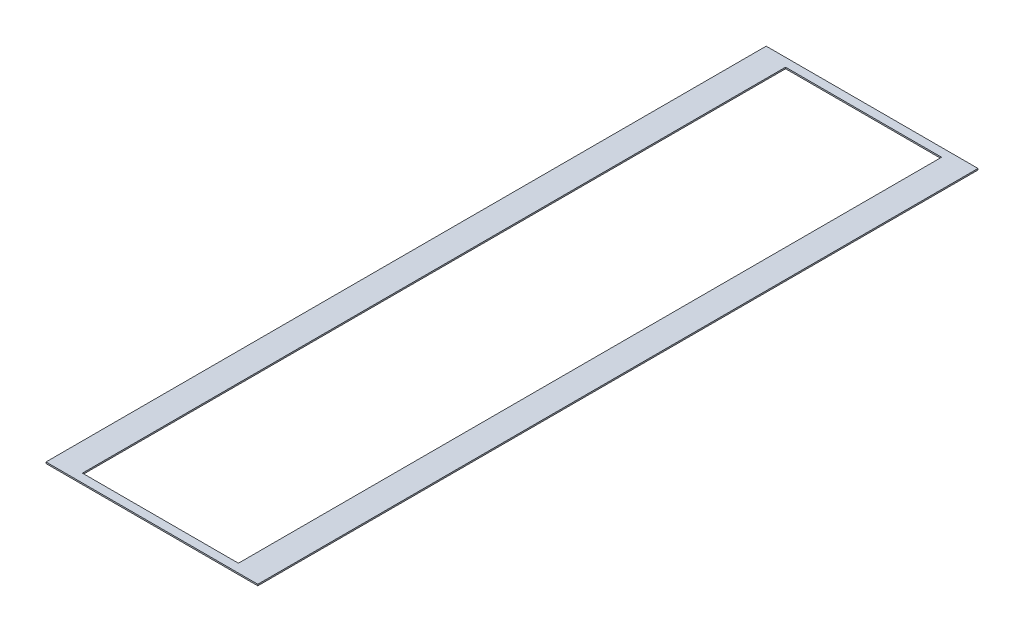
ISO-10303-21;
HEADER;
FILE_DESCRIPTION(('STEP AP214'),'2;1');
FILE_NAME('part.step','',(''),(''),'','','');
FILE_SCHEMA(('AUTOMOTIVE_DESIGN { 1 0 10303 214 1 1 1 1 }'));
ENDSEC;
DATA;
#1=APPLICATION_CONTEXT('core data for automotive mechanical design processes');
#2=APPLICATION_PROTOCOL_DEFINITION('international standard','automotive_design',2000,#1);
#3=PRODUCT_CONTEXT('',#1,'mechanical');
#4=PRODUCT('Part','Part','',(#3));
#5=PRODUCT_RELATED_PRODUCT_CATEGORY('part','',(#4));
#6=PRODUCT_DEFINITION_FORMATION('','',#4);
#7=PRODUCT_DEFINITION_CONTEXT('part definition',#1,'design');
#8=PRODUCT_DEFINITION('design','',#6,#7);
#9=PRODUCT_DEFINITION_SHAPE('','',#8);
#10=(LENGTH_UNIT() NAMED_UNIT(*) SI_UNIT(.MILLI.,.METRE.));
#11=(NAMED_UNIT(*) PLANE_ANGLE_UNIT() SI_UNIT($,.RADIAN.));
#12=(NAMED_UNIT(*) SI_UNIT($,.STERADIAN.) SOLID_ANGLE_UNIT());
#13=UNCERTAINTY_MEASURE_WITH_UNIT(LENGTH_MEASURE(1.E-05),#10,'distance_accuracy_value','');
#14=(GEOMETRIC_REPRESENTATION_CONTEXT(3) GLOBAL_UNCERTAINTY_ASSIGNED_CONTEXT((#13)) GLOBAL_UNIT_ASSIGNED_CONTEXT((#10,
#11,#12)) REPRESENTATION_CONTEXT('',''));
#15=CARTESIAN_POINT('',(0.,0.,0.));
#16=DIRECTION('',(0.,0.,1.));
#17=DIRECTION('',(1.,0.,0.));
#18=AXIS2_PLACEMENT_3D('',#15,#16,#17);
#19=CARTESIAN_POINT('',(75.,1.,-255.));
#20=DIRECTION('',(-1.,0.,0.));
#21=DIRECTION('',(0.,0.,1.));
#22=AXIS2_PLACEMENT_3D('',#19,#20,#21);
#23=PLANE('',#22);
#24=DIRECTION('',(0.,0.,-1.));
#25=VECTOR('',#24,1.);
#26=CARTESIAN_POINT('',(75.,0.,-255.));
#27=LINE('',#26,#25);
#28=CARTESIAN_POINT('',(75.,0.,255.));
#29=VERTEX_POINT('',#28);
#30=CARTESIAN_POINT('',(75.,0.,-255.));
#31=VERTEX_POINT('',#30);
#32=EDGE_CURVE('E147',#29,#31,#27,.T.);
#33=ORIENTED_EDGE('',*,*,#32,.T.);
#34=DIRECTION('',(0.,-1.,0.));
#35=VECTOR('',#34,1.);
#36=CARTESIAN_POINT('',(75.,1.,-255.));
#37=LINE('',#36,#35);
#38=CARTESIAN_POINT('',(75.,1.,-255.));
#39=VERTEX_POINT('',#38);
#40=EDGE_CURVE('E11',#39,#31,#37,.T.);
#41=ORIENTED_EDGE('',*,*,#40,.F.);
#42=DIRECTION('',(0.,0.,-1.));
#43=VECTOR('',#42,1.);
#44=CARTESIAN_POINT('',(75.,1.,-255.));
#45=LINE('',#44,#43);
#46=CARTESIAN_POINT('',(75.,1.,255.));
#47=VERTEX_POINT('',#46);
#48=EDGE_CURVE('E153',#47,#39,#45,.T.);
#49=ORIENTED_EDGE('',*,*,#48,.F.);
#50=DIRECTION('',(0.,-1.,0.));
#51=VECTOR('',#50,1.);
#52=CARTESIAN_POINT('',(75.,1.,255.));
#53=LINE('',#52,#51);
#54=EDGE_CURVE('E167',#47,#29,#53,.T.);
#55=ORIENTED_EDGE('',*,*,#54,.T.);
#56=EDGE_LOOP('',(#33,#41,#49,#55));
#57=FACE_BOUND('',#56,.T.);
#58=ADVANCED_FACE('F39',(#57),#23,.F.);
#59=CARTESIAN_POINT('',(-75.,1.,-255.));
#60=DIRECTION('',(0.,0.,1.));
#61=DIRECTION('',(1.,0.,0.));
#62=AXIS2_PLACEMENT_3D('',#59,#60,#61);
#63=PLANE('',#62);
#64=DIRECTION('',(-1.,0.,0.));
#65=VECTOR('',#64,1.);
#66=CARTESIAN_POINT('',(-75.,0.,-255.));
#67=LINE('',#66,#65);
#68=CARTESIAN_POINT('',(-75.,0.,-255.));
#69=VERTEX_POINT('',#68);
#70=EDGE_CURVE('E171',#31,#69,#67,.T.);
#71=ORIENTED_EDGE('',*,*,#70,.T.);
#72=DIRECTION('',(0.,-1.,0.));
#73=VECTOR('',#72,1.);
#74=CARTESIAN_POINT('',(-75.,1.,-255.));
#75=LINE('',#74,#73);
#76=CARTESIAN_POINT('',(-75.,1.,-255.));
#77=VERTEX_POINT('',#76);
#78=EDGE_CURVE('E47',#77,#69,#75,.T.);
#79=ORIENTED_EDGE('',*,*,#78,.F.);
#80=DIRECTION('',(-1.,0.,0.));
#81=VECTOR('',#80,1.);
#82=CARTESIAN_POINT('',(-75.,1.,-255.));
#83=LINE('',#82,#81);
#84=EDGE_CURVE('E157',#39,#77,#83,.T.);
#85=ORIENTED_EDGE('',*,*,#84,.F.);
#86=ORIENTED_EDGE('',*,*,#40,.T.);
#87=EDGE_LOOP('',(#71,#79,#85,#86));
#88=FACE_BOUND('',#87,.T.);
#89=ADVANCED_FACE('F205',(#88),#63,.F.);
#90=CARTESIAN_POINT('',(-75.,1.,-255.));
#91=DIRECTION('',(1.,0.,0.));
#92=DIRECTION('',(0.,0.,-1.));
#93=AXIS2_PLACEMENT_3D('',#90,#91,#92);
#94=PLANE('',#93);
#95=DIRECTION('',(0.,0.,1.));
#96=VECTOR('',#95,1.);
#97=CARTESIAN_POINT('',(-75.,0.,-255.));
#98=LINE('',#97,#96);
#99=CARTESIAN_POINT('',(-75.,0.,255.));
#100=VERTEX_POINT('',#99);
#101=EDGE_CURVE('E174',#69,#100,#98,.T.);
#102=ORIENTED_EDGE('',*,*,#101,.T.);
#103=DIRECTION('',(0.,-1.,0.));
#104=VECTOR('',#103,1.);
#105=CARTESIAN_POINT('',(-75.,1.,255.));
#106=LINE('',#105,#104);
#107=CARTESIAN_POINT('',(-75.,1.,255.));
#108=VERTEX_POINT('',#107);
#109=EDGE_CURVE('E182',#108,#100,#106,.T.);
#110=ORIENTED_EDGE('',*,*,#109,.F.);
#111=DIRECTION('',(0.,0.,1.));
#112=VECTOR('',#111,1.);
#113=CARTESIAN_POINT('',(-75.,1.,-255.));
#114=LINE('',#113,#112);
#115=EDGE_CURVE('E161',#77,#108,#114,.T.);
#116=ORIENTED_EDGE('',*,*,#115,.F.);
#117=ORIENTED_EDGE('',*,*,#78,.T.);
#118=EDGE_LOOP('',(#102,#110,#116,#117));
#119=FACE_BOUND('',#118,.T.);
#120=ADVANCED_FACE('F191',(#119),#94,.F.);
#121=CARTESIAN_POINT('',(-75.,1.,255.));
#122=DIRECTION('',(0.,0.,-1.));
#123=DIRECTION('',(-1.,0.,0.));
#124=AXIS2_PLACEMENT_3D('',#121,#122,#123);
#125=PLANE('',#124);
#126=DIRECTION('',(1.,0.,0.));
#127=VECTOR('',#126,1.);
#128=CARTESIAN_POINT('',(-75.,0.,255.));
#129=LINE('',#128,#127);
#130=EDGE_CURVE('E158',#100,#29,#129,.T.);
#131=ORIENTED_EDGE('',*,*,#130,.T.);
#132=ORIENTED_EDGE('',*,*,#54,.F.);
#133=DIRECTION('',(1.,0.,0.));
#134=VECTOR('',#133,1.);
#135=CARTESIAN_POINT('',(-75.,1.,255.));
#136=LINE('',#135,#134);
#137=EDGE_CURVE('E164',#108,#47,#136,.T.);
#138=ORIENTED_EDGE('',*,*,#137,.F.);
#139=ORIENTED_EDGE('',*,*,#109,.T.);
#140=EDGE_LOOP('',(#131,#132,#138,#139));
#141=FACE_BOUND('',#140,.T.);
#142=ADVANCED_FACE('F198',(#141),#125,.F.);
#143=CARTESIAN_POINT('',(0.,1.,0.));
#144=DIRECTION('',(0.,1.,0.));
#145=DIRECTION('',(0.,0.,1.));
#146=AXIS2_PLACEMENT_3D('',#143,#144,#145);
#147=PLANE('',#146);
#148=DIRECTION('',(0.,0.,-1.));
#149=VECTOR('',#148,1.);
#150=CARTESIAN_POINT('',(55.2350560882285,1.,-248.97573391443));
#151=LINE('',#150,#149);
#152=CARTESIAN_POINT('',(55.2350560882285,1.,248.97573391443));
#153=VERTEX_POINT('',#152);
#154=CARTESIAN_POINT('',(55.2350560882285,1.,-248.97573391443));
#155=VERTEX_POINT('',#154);
#156=EDGE_CURVE('E54',#153,#155,#151,.T.);
#157=ORIENTED_EDGE('',*,*,#156,.F.);
#158=DIRECTION('',(1.,0.,0.));
#159=VECTOR('',#158,1.);
#160=CARTESIAN_POINT('',(-55.2350560882285,1.,248.97573391443));
#161=LINE('',#160,#159);
#162=CARTESIAN_POINT('',(-55.2350560882285,1.,248.97573391443));
#163=VERTEX_POINT('',#162);
#164=EDGE_CURVE('E125',#163,#153,#161,.T.);
#165=ORIENTED_EDGE('',*,*,#164,.F.);
#166=DIRECTION('',(0.,0.,1.));
#167=VECTOR('',#166,1.);
#168=CARTESIAN_POINT('',(-55.2350560882285,1.,-248.97573391443));
#169=LINE('',#168,#167);
#170=CARTESIAN_POINT('',(-55.2350560882285,1.,-248.97573391443));
#171=VERTEX_POINT('',#170);
#172=EDGE_CURVE('E129',#171,#163,#169,.T.);
#173=ORIENTED_EDGE('',*,*,#172,.F.);
#174=DIRECTION('',(-1.,0.,0.));
#175=VECTOR('',#174,1.);
#176=CARTESIAN_POINT('',(-55.2350560882285,1.,-248.97573391443));
#177=LINE('',#176,#175);
#178=EDGE_CURVE('E138',#155,#171,#177,.T.);
#179=ORIENTED_EDGE('',*,*,#178,.F.);
#180=EDGE_LOOP('',(#157,#165,#173,#179));
#181=FACE_BOUND('',#180,.T.);
#182=ORIENTED_EDGE('',*,*,#48,.T.);
#183=ORIENTED_EDGE('',*,*,#84,.T.);
#184=ORIENTED_EDGE('',*,*,#115,.T.);
#185=ORIENTED_EDGE('',*,*,#137,.T.);
#186=EDGE_LOOP('',(#182,#183,#184,#185));
#187=FACE_BOUND('',#186,.T.);
#188=ADVANCED_FACE('F204',(#181,#187),#147,.T.);
#189=CARTESIAN_POINT('',(0.,0.,0.));
#190=DIRECTION('',(0.,1.,0.));
#191=DIRECTION('',(0.,0.,1.));
#192=AXIS2_PLACEMENT_3D('',#189,#190,#191);
#193=PLANE('',#192);
#194=DIRECTION('',(1.,0.,0.));
#195=VECTOR('',#194,1.);
#196=CARTESIAN_POINT('',(-55.2350560882285,0.,248.97573391443));
#197=LINE('',#196,#195);
#198=CARTESIAN_POINT('',(-55.2350560882285,0.,248.97573391443));
#199=VERTEX_POINT('',#198);
#200=CARTESIAN_POINT('',(55.2350560882285,0.,248.97573391443));
#201=VERTEX_POINT('',#200);
#202=EDGE_CURVE('E113',#199,#201,#197,.T.);
#203=ORIENTED_EDGE('',*,*,#202,.T.);
#204=DIRECTION('',(0.,0.,-1.));
#205=VECTOR('',#204,1.);
#206=CARTESIAN_POINT('',(55.2350560882285,0.,-248.97573391443));
#207=LINE('',#206,#205);
#208=CARTESIAN_POINT('',(55.2350560882285,0.,-248.97573391443));
#209=VERTEX_POINT('',#208);
#210=EDGE_CURVE('E106',#201,#209,#207,.T.);
#211=ORIENTED_EDGE('',*,*,#210,.T.);
#212=DIRECTION('',(-1.,0.,0.));
#213=VECTOR('',#212,1.);
#214=CARTESIAN_POINT('',(-55.2350560882285,0.,-248.97573391443));
#215=LINE('',#214,#213);
#216=CARTESIAN_POINT('',(-55.2350560882285,0.,-248.97573391443));
#217=VERTEX_POINT('',#216);
#218=EDGE_CURVE('E116',#209,#217,#215,.T.);
#219=ORIENTED_EDGE('',*,*,#218,.T.);
#220=DIRECTION('',(0.,0.,1.));
#221=VECTOR('',#220,1.);
#222=CARTESIAN_POINT('',(-55.2350560882285,0.,-248.97573391443));
#223=LINE('',#222,#221);
#224=EDGE_CURVE('E62',#217,#199,#223,.T.);
#225=ORIENTED_EDGE('',*,*,#224,.T.);
#226=EDGE_LOOP('',(#203,#211,#219,#225));
#227=FACE_BOUND('',#226,.T.);
#228=ORIENTED_EDGE('',*,*,#32,.F.);
#229=ORIENTED_EDGE('',*,*,#130,.F.);
#230=ORIENTED_EDGE('',*,*,#101,.F.);
#231=ORIENTED_EDGE('',*,*,#70,.F.);
#232=EDGE_LOOP('',(#228,#229,#230,#231));
#233=FACE_BOUND('',#232,.T.);
#234=ADVANCED_FACE('F121',(#227,#233),#193,.F.);
#235=CARTESIAN_POINT('',(55.2350560882285,0.,-248.97573391443));
#236=DIRECTION('',(1.,0.,0.));
#237=DIRECTION('',(0.,0.,-1.));
#238=AXIS2_PLACEMENT_3D('',#235,#236,#237);
#239=PLANE('',#238);
#240=ORIENTED_EDGE('',*,*,#156,.T.);
#241=DIRECTION('',(0.,1.,0.));
#242=VECTOR('',#241,1.);
#243=CARTESIAN_POINT('',(55.2350560882285,0.,-248.97573391443));
#244=LINE('',#243,#242);
#245=EDGE_CURVE('E102',#209,#155,#244,.T.);
#246=ORIENTED_EDGE('',*,*,#245,.F.);
#247=ORIENTED_EDGE('',*,*,#210,.F.);
#248=DIRECTION('',(0.,1.,0.));
#249=VECTOR('',#248,1.);
#250=CARTESIAN_POINT('',(55.2350560882285,0.,248.97573391443));
#251=LINE('',#250,#249);
#252=EDGE_CURVE('E144',#201,#153,#251,.T.);
#253=ORIENTED_EDGE('',*,*,#252,.T.);
#254=EDGE_LOOP('',(#240,#246,#247,#253));
#255=FACE_BOUND('',#254,.T.);
#256=ADVANCED_FACE('F104',(#255),#239,.F.);
#257=CARTESIAN_POINT('',(-55.2350560882285,0.,248.97573391443));
#258=DIRECTION('',(0.,0.,1.));
#259=DIRECTION('',(1.,0.,0.));
#260=AXIS2_PLACEMENT_3D('',#257,#258,#259);
#261=PLANE('',#260);
#262=ORIENTED_EDGE('',*,*,#164,.T.);
#263=ORIENTED_EDGE('',*,*,#252,.F.);
#264=ORIENTED_EDGE('',*,*,#202,.F.);
#265=DIRECTION('',(0.,1.,0.));
#266=VECTOR('',#265,1.);
#267=CARTESIAN_POINT('',(-55.2350560882285,0.,248.97573391443));
#268=LINE('',#267,#266);
#269=EDGE_CURVE('E148',#199,#163,#268,.T.);
#270=ORIENTED_EDGE('',*,*,#269,.T.);
#271=EDGE_LOOP('',(#262,#263,#264,#270));
#272=FACE_BOUND('',#271,.T.);
#273=ADVANCED_FACE('F222',(#272),#261,.F.);
#274=CARTESIAN_POINT('',(-55.2350560882285,0.,-248.97573391443));
#275=DIRECTION('',(-1.,0.,0.));
#276=DIRECTION('',(0.,0.,1.));
#277=AXIS2_PLACEMENT_3D('',#274,#275,#276);
#278=PLANE('',#277);
#279=ORIENTED_EDGE('',*,*,#172,.T.);
#280=ORIENTED_EDGE('',*,*,#269,.F.);
#281=ORIENTED_EDGE('',*,*,#224,.F.);
#282=DIRECTION('',(0.,1.,0.));
#283=VECTOR('',#282,1.);
#284=CARTESIAN_POINT('',(-55.2350560882285,0.,-248.97573391443));
#285=LINE('',#284,#283);
#286=EDGE_CURVE('E112',#217,#171,#285,.T.);
#287=ORIENTED_EDGE('',*,*,#286,.T.);
#288=EDGE_LOOP('',(#279,#280,#281,#287));
#289=FACE_BOUND('',#288,.T.);
#290=ADVANCED_FACE('F225',(#289),#278,.F.);
#291=CARTESIAN_POINT('',(-55.2350560882285,0.,-248.97573391443));
#292=DIRECTION('',(0.,0.,-1.));
#293=DIRECTION('',(-1.,0.,0.));
#294=AXIS2_PLACEMENT_3D('',#291,#292,#293);
#295=PLANE('',#294);
#296=ORIENTED_EDGE('',*,*,#178,.T.);
#297=ORIENTED_EDGE('',*,*,#286,.F.);
#298=ORIENTED_EDGE('',*,*,#218,.F.);
#299=ORIENTED_EDGE('',*,*,#245,.T.);
#300=EDGE_LOOP('',(#296,#297,#298,#299));
#301=FACE_BOUND('',#300,.T.);
#302=ADVANCED_FACE('F117',(#301),#295,.F.);
#303=CLOSED_SHELL('',(#58,#89,#120,#142,#188,#234,#256,#273,#290,#302));
#304=MANIFOLD_SOLID_BREP('B2',#303);
#305=ADVANCED_BREP_SHAPE_REPRESENTATION('',(#18,#304),#14);
#306=SHAPE_DEFINITION_REPRESENTATION(#9,#305);
ENDSEC;
END-ISO-10303-21;
